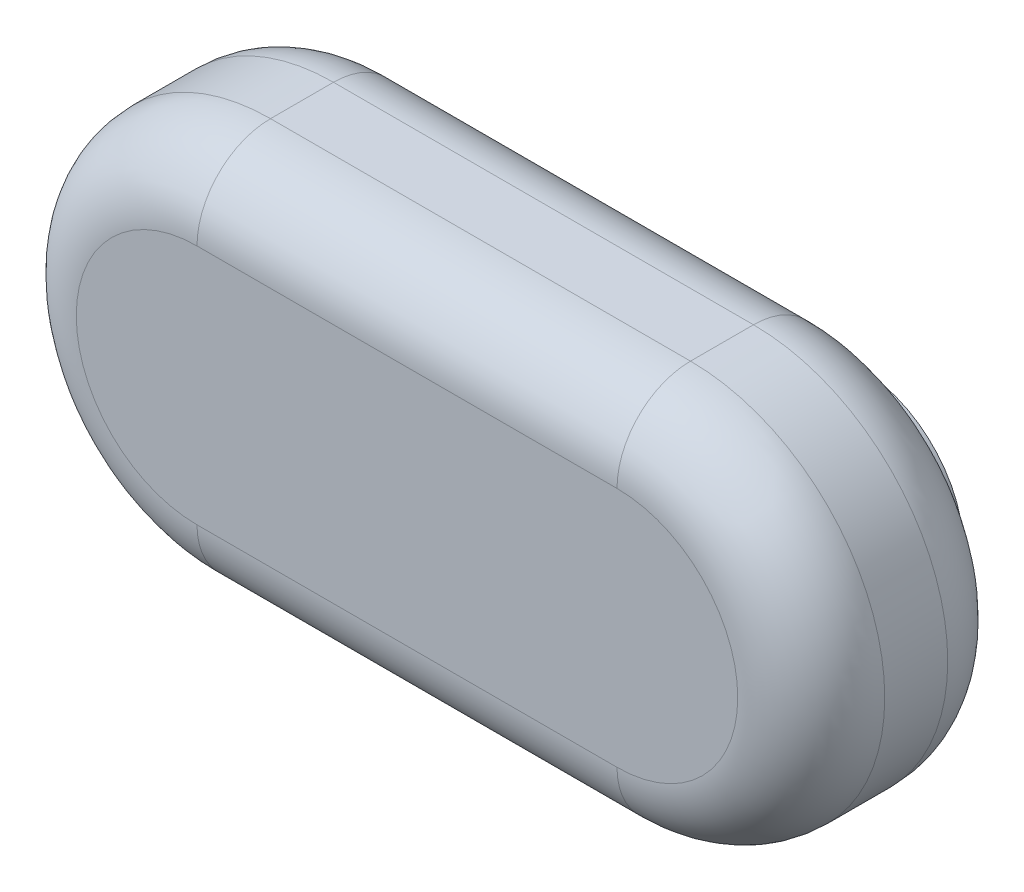
ISO-10303-21;
HEADER;
FILE_DESCRIPTION(('STEP AP214'),'2;1');
FILE_NAME('part.step','',(''),(''),'','','');
FILE_SCHEMA(('AUTOMOTIVE_DESIGN { 1 0 10303 214 1 1 1 1 }'));
ENDSEC;
DATA;
#1=APPLICATION_CONTEXT('core data for automotive mechanical design processes');
#2=APPLICATION_PROTOCOL_DEFINITION('international standard','automotive_design',2000,#1);
#3=PRODUCT_CONTEXT('',#1,'mechanical');
#4=PRODUCT('Part','Part','',(#3));
#5=PRODUCT_RELATED_PRODUCT_CATEGORY('part','',(#4));
#6=PRODUCT_DEFINITION_FORMATION('','',#4);
#7=PRODUCT_DEFINITION_CONTEXT('part definition',#1,'design');
#8=PRODUCT_DEFINITION('design','',#6,#7);
#9=PRODUCT_DEFINITION_SHAPE('','',#8);
#10=(LENGTH_UNIT() NAMED_UNIT(*) SI_UNIT(.MILLI.,.METRE.));
#11=(NAMED_UNIT(*) PLANE_ANGLE_UNIT() SI_UNIT($,.RADIAN.));
#12=(NAMED_UNIT(*) SI_UNIT($,.STERADIAN.) SOLID_ANGLE_UNIT());
#13=UNCERTAINTY_MEASURE_WITH_UNIT(LENGTH_MEASURE(1.E-05),#10,'distance_accuracy_value','');
#14=(GEOMETRIC_REPRESENTATION_CONTEXT(3) GLOBAL_UNCERTAINTY_ASSIGNED_CONTEXT((#13)) GLOBAL_UNIT_ASSIGNED_CONTEXT((#10,
#11,#12)) REPRESENTATION_CONTEXT('',''));
#15=CARTESIAN_POINT('',(0.,0.,0.));
#16=DIRECTION('',(0.,0.,1.));
#17=DIRECTION('',(1.,0.,0.));
#18=AXIS2_PLACEMENT_3D('',#15,#16,#17);
#19=CARTESIAN_POINT('',(-31.0422971957516,0.777981447534978,20.));
#20=DIRECTION('',(0.,0.,-1.));
#21=DIRECTION('',(-1.,0.,0.));
#22=AXIS2_PLACEMENT_3D('',#19,#20,#21);
#23=CYLINDRICAL_SURFACE('',#22,18.5);
#24=DIRECTION('',(0.,0.,-1.));
#25=VECTOR('',#24,1.);
#26=CARTESIAN_POINT('',(-31.0422971957516,-17.722018552465,20.));
#27=LINE('',#26,#25);
#28=CARTESIAN_POINT('',(-31.0422971957516,-17.722018552465,13.));
#29=VERTEX_POINT('',#28);
#30=CARTESIAN_POINT('',(-31.0422971957516,-17.722018552465,7.));
#31=VERTEX_POINT('',#30);
#32=EDGE_CURVE('E215',#29,#31,#27,.T.);
#33=ORIENTED_EDGE('',*,*,#32,.T.);
#34=CARTESIAN_POINT('',(-31.0422971957516,0.777981447534978,7.));
#35=DIRECTION('',(0.,0.,-1.));
#36=DIRECTION('',(-1.,0.,0.));
#37=AXIS2_PLACEMENT_3D('',#34,#35,#36);
#38=CIRCLE('',#37,18.5);
#39=CARTESIAN_POINT('',(-31.0422971957516,19.277981447535,7.));
#40=VERTEX_POINT('',#39);
#41=EDGE_CURVE('E244',#31,#40,#38,.F.);
#42=ORIENTED_EDGE('',*,*,#41,.T.);
#43=DIRECTION('',(0.,0.,-1.));
#44=VECTOR('',#43,1.);
#45=CARTESIAN_POINT('',(-31.0422971957516,19.277981447535,20.));
#46=LINE('',#45,#44);
#47=CARTESIAN_POINT('',(-31.0422971957516,19.277981447535,13.));
#48=VERTEX_POINT('',#47);
#49=EDGE_CURVE('E194',#48,#40,#46,.T.);
#50=ORIENTED_EDGE('',*,*,#49,.F.);
#51=CARTESIAN_POINT('',(-31.0422971957516,0.777981447534978,13.));
#52=DIRECTION('',(0.,0.,-1.));
#53=DIRECTION('',(-1.,0.,0.));
#54=AXIS2_PLACEMENT_3D('',#51,#52,#53);
#55=CIRCLE('',#54,18.5);
#56=EDGE_CURVE('E241',#48,#29,#55,.T.);
#57=ORIENTED_EDGE('',*,*,#56,.T.);
#58=EDGE_LOOP('',(#33,#42,#50,#57));
#59=FACE_BOUND('',#58,.T.);
#60=ADVANCED_FACE('F40',(#59),#23,.T.);
#61=CARTESIAN_POINT('',(-31.0422971957516,19.277981447535,20.));
#62=DIRECTION('',(0.,-1.,0.));
#63=DIRECTION('',(0.,0.,-1.));
#64=AXIS2_PLACEMENT_3D('',#61,#62,#63);
#65=PLANE('',#64);
#66=ORIENTED_EDGE('',*,*,#49,.T.);
#67=DIRECTION('',(-1.,0.,0.));
#68=VECTOR('',#67,1.);
#69=CARTESIAN_POINT('',(-71.0422971957516,19.277981447535,7.));
#70=LINE('',#69,#68);
#71=CARTESIAN_POINT('',(-71.0422971957516,19.277981447535,7.));
#72=VERTEX_POINT('',#71);
#73=EDGE_CURVE('E193',#40,#72,#70,.T.);
#74=ORIENTED_EDGE('',*,*,#73,.T.);
#75=DIRECTION('',(0.,0.,-1.));
#76=VECTOR('',#75,1.);
#77=CARTESIAN_POINT('',(-71.0422971957516,19.277981447535,20.));
#78=LINE('',#77,#76);
#79=CARTESIAN_POINT('',(-71.0422971957516,19.277981447535,13.));
#80=VERTEX_POINT('',#79);
#81=EDGE_CURVE('E200',#80,#72,#78,.T.);
#82=ORIENTED_EDGE('',*,*,#81,.F.);
#83=DIRECTION('',(-1.,0.,0.));
#84=VECTOR('',#83,1.);
#85=CARTESIAN_POINT('',(-31.0422971957516,19.277981447535,13.));
#86=LINE('',#85,#84);
#87=EDGE_CURVE('E184',#80,#48,#86,.F.);
#88=ORIENTED_EDGE('',*,*,#87,.T.);
#89=EDGE_LOOP('',(#66,#74,#82,#88));
#90=FACE_BOUND('',#89,.T.);
#91=ADVANCED_FACE('F208',(#90),#65,.F.);
#92=CARTESIAN_POINT('',(-71.0422971957516,0.777981447534977,20.));
#93=DIRECTION('',(0.,0.,-1.));
#94=DIRECTION('',(-1.,0.,0.));
#95=AXIS2_PLACEMENT_3D('',#92,#93,#94);
#96=CYLINDRICAL_SURFACE('',#95,18.5);
#97=ORIENTED_EDGE('',*,*,#81,.T.);
#98=CARTESIAN_POINT('',(-71.0422971957516,0.777981447534977,7.));
#99=DIRECTION('',(0.,0.,-1.));
#100=DIRECTION('',(-1.,0.,0.));
#101=AXIS2_PLACEMENT_3D('',#98,#99,#100);
#102=CIRCLE('',#101,18.5);
#103=CARTESIAN_POINT('',(-71.0422971957516,-17.722018552465,7.));
#104=VERTEX_POINT('',#103);
#105=EDGE_CURVE('E204',#72,#104,#102,.F.);
#106=ORIENTED_EDGE('',*,*,#105,.T.);
#107=DIRECTION('',(0.,0.,-1.));
#108=VECTOR('',#107,1.);
#109=CARTESIAN_POINT('',(-71.0422971957516,-17.722018552465,20.));
#110=LINE('',#109,#108);
#111=CARTESIAN_POINT('',(-71.0422971957516,-17.722018552465,13.));
#112=VERTEX_POINT('',#111);
#113=EDGE_CURVE('E202',#112,#104,#110,.T.);
#114=ORIENTED_EDGE('',*,*,#113,.F.);
#115=CARTESIAN_POINT('',(-71.0422971957516,0.777981447534977,13.));
#116=DIRECTION('',(0.,0.,-1.));
#117=DIRECTION('',(-1.,0.,0.));
#118=AXIS2_PLACEMENT_3D('',#115,#116,#117);
#119=CIRCLE('',#118,18.5);
#120=EDGE_CURVE('E176',#112,#80,#119,.T.);
#121=ORIENTED_EDGE('',*,*,#120,.T.);
#122=EDGE_LOOP('',(#97,#106,#114,#121));
#123=FACE_BOUND('',#122,.T.);
#124=ADVANCED_FACE('F199',(#123),#96,.T.);
#125=CARTESIAN_POINT('',(-71.0422971957516,-17.722018552465,20.));
#126=DIRECTION('',(0.,1.,0.));
#127=DIRECTION('',(-1.,0.,0.));
#128=AXIS2_PLACEMENT_3D('',#125,#126,#127);
#129=PLANE('',#128);
#130=ORIENTED_EDGE('',*,*,#113,.T.);
#131=DIRECTION('',(1.,0.,0.));
#132=VECTOR('',#131,1.);
#133=CARTESIAN_POINT('',(-31.0422971957516,-17.722018552465,7.));
#134=LINE('',#133,#132);
#135=EDGE_CURVE('E238',#104,#31,#134,.T.);
#136=ORIENTED_EDGE('',*,*,#135,.T.);
#137=ORIENTED_EDGE('',*,*,#32,.F.);
#138=DIRECTION('',(1.,0.,0.));
#139=VECTOR('',#138,1.);
#140=CARTESIAN_POINT('',(-71.0422971957516,-17.722018552465,13.));
#141=LINE('',#140,#139);
#142=EDGE_CURVE('E235',#29,#112,#141,.F.);
#143=ORIENTED_EDGE('',*,*,#142,.T.);
#144=EDGE_LOOP('',(#130,#136,#137,#143));
#145=FACE_BOUND('',#144,.T.);
#146=ADVANCED_FACE('F647',(#145),#129,.F.);
#147=CARTESIAN_POINT('',(-31.0422971957516,0.777981447534978,20.));
#148=DIRECTION('',(0.,0.,-1.));
#149=DIRECTION('',(-1.,0.,0.));
#150=AXIS2_PLACEMENT_3D('',#147,#148,#149);
#151=PLANE('',#150);
#152=DIRECTION('',(-1.,0.,0.));
#153=VECTOR('',#152,1.);
#154=CARTESIAN_POINT('',(-31.0422971957516,12.277981447535,20.));
#155=LINE('',#154,#153);
#156=CARTESIAN_POINT('',(-31.0422971957516,12.277981447535,20.));
#157=VERTEX_POINT('',#156);
#158=CARTESIAN_POINT('',(-71.0422971957516,12.277981447535,20.));
#159=VERTEX_POINT('',#158);
#160=EDGE_CURVE('E247',#157,#159,#155,.T.);
#161=ORIENTED_EDGE('',*,*,#160,.T.);
#162=CARTESIAN_POINT('',(-71.0422971957516,0.777981447534977,20.));
#163=DIRECTION('',(0.,0.,-1.));
#164=DIRECTION('',(-1.,0.,0.));
#165=AXIS2_PLACEMENT_3D('',#162,#163,#164);
#166=CIRCLE('',#165,11.5);
#167=CARTESIAN_POINT('',(-71.0422971957516,-10.722018552465,20.));
#168=VERTEX_POINT('',#167);
#169=EDGE_CURVE('E177',#159,#168,#166,.F.);
#170=ORIENTED_EDGE('',*,*,#169,.T.);
#171=DIRECTION('',(1.,0.,0.));
#172=VECTOR('',#171,1.);
#173=CARTESIAN_POINT('',(-31.0422971957516,-10.722018552465,20.));
#174=LINE('',#173,#172);
#175=CARTESIAN_POINT('',(-31.0422971957516,-10.722018552465,20.));
#176=VERTEX_POINT('',#175);
#177=EDGE_CURVE('E129',#168,#176,#174,.T.);
#178=ORIENTED_EDGE('',*,*,#177,.T.);
#179=CARTESIAN_POINT('',(-31.0422971957516,0.777981447534978,20.));
#180=DIRECTION('',(0.,0.,-1.));
#181=DIRECTION('',(-1.,0.,0.));
#182=AXIS2_PLACEMENT_3D('',#179,#180,#181);
#183=CIRCLE('',#182,11.5);
#184=EDGE_CURVE('E250',#176,#157,#183,.F.);
#185=ORIENTED_EDGE('',*,*,#184,.T.);
#186=EDGE_LOOP('',(#161,#170,#178,#185));
#187=FACE_BOUND('',#186,.T.);
#188=ADVANCED_FACE('F639',(#187),#151,.F.);
#189=CARTESIAN_POINT('',(-31.0422971957516,0.777981447534978,0.));
#190=DIRECTION('',(0.,0.,-1.));
#191=DIRECTION('',(-1.,0.,0.));
#192=AXIS2_PLACEMENT_3D('',#189,#190,#191);
#193=PLANE('',#192);
#194=CARTESIAN_POINT('',(-31.0422971957516,0.777981447534969,0.));
#195=DIRECTION('',(0.,0.,-1.));
#196=DIRECTION('',(-1.,0.,0.));
#197=AXIS2_PLACEMENT_3D('',#194,#195,#196);
#198=CIRCLE('',#197,10.);
#199=CARTESIAN_POINT('',(-41.0422971957516,0.777981447534969,0.));
#200=VERTEX_POINT('',#199);
#201=EDGE_CURVE('E714',#200,#200,#198,.T.);
#202=ORIENTED_EDGE('',*,*,#201,.F.);
#203=EDGE_LOOP('',(#202));
#204=FACE_BOUND('',#203,.T.);
#205=CARTESIAN_POINT('',(-71.0422971957516,0.777981447534977,0.));
#206=DIRECTION('',(0.,0.,-1.));
#207=DIRECTION('',(-1.,0.,0.));
#208=AXIS2_PLACEMENT_3D('',#205,#206,#207);
#209=CIRCLE('',#208,11.5);
#210=CARTESIAN_POINT('',(-71.0422971957516,-10.722018552465,0.));
#211=VERTEX_POINT('',#210);
#212=CARTESIAN_POINT('',(-71.0422971957516,12.277981447535,0.));
#213=VERTEX_POINT('',#212);
#214=EDGE_CURVE('E227',#211,#213,#209,.T.);
#215=ORIENTED_EDGE('',*,*,#214,.T.);
#216=DIRECTION('',(-1.,0.,0.));
#217=VECTOR('',#216,1.);
#218=CARTESIAN_POINT('',(-31.0422971957516,12.277981447535,0.));
#219=LINE('',#218,#217);
#220=CARTESIAN_POINT('',(-31.0422971957516,12.277981447535,0.));
#221=VERTEX_POINT('',#220);
#222=EDGE_CURVE('E205',#213,#221,#219,.F.);
#223=ORIENTED_EDGE('',*,*,#222,.T.);
#224=CARTESIAN_POINT('',(-31.0422971957516,0.777981447534978,0.));
#225=DIRECTION('',(0.,0.,-1.));
#226=DIRECTION('',(-1.,0.,0.));
#227=AXIS2_PLACEMENT_3D('',#224,#225,#226);
#228=CIRCLE('',#227,11.5);
#229=CARTESIAN_POINT('',(-31.0422971957516,-10.722018552465,0.));
#230=VERTEX_POINT('',#229);
#231=EDGE_CURVE('E221',#221,#230,#228,.T.);
#232=ORIENTED_EDGE('',*,*,#231,.T.);
#233=DIRECTION('',(1.,0.,0.));
#234=VECTOR('',#233,1.);
#235=CARTESIAN_POINT('',(-71.0422971957516,-10.722018552465,0.));
#236=LINE('',#235,#234);
#237=EDGE_CURVE('E224',#230,#211,#236,.F.);
#238=ORIENTED_EDGE('',*,*,#237,.T.);
#239=EDGE_LOOP('',(#215,#223,#232,#238));
#240=FACE_BOUND('',#239,.T.);
#241=ADVANCED_FACE('F630',(#204,#240),#193,.T.);
#242=CARTESIAN_POINT('',(-71.0422971957516,-10.722018552465,7.));
#243=DIRECTION('',(-1.,0.,0.));
#244=DIRECTION('',(0.,-1.,0.));
#245=AXIS2_PLACEMENT_3D('',#242,#243,#244);
#246=CYLINDRICAL_SURFACE('',#245,7.);
#247=CARTESIAN_POINT('',(-71.0422971957516,-10.722018552465,7.));
#248=DIRECTION('',(-1.,0.,0.));
#249=DIRECTION('',(0.,0.,1.));
#250=AXIS2_PLACEMENT_3D('',#247,#248,#249);
#251=CIRCLE('',#250,7.);
#252=EDGE_CURVE('E263',#211,#104,#251,.T.);
#253=ORIENTED_EDGE('',*,*,#252,.F.);
#254=ORIENTED_EDGE('',*,*,#237,.F.);
#255=CARTESIAN_POINT('',(-31.0422971957516,-10.722018552465,7.));
#256=DIRECTION('',(1.,0.,0.));
#257=DIRECTION('',(0.,1.,0.));
#258=AXIS2_PLACEMENT_3D('',#255,#256,#257);
#259=CIRCLE('',#258,7.);
#260=EDGE_CURVE('E267',#31,#230,#259,.T.);
#261=ORIENTED_EDGE('',*,*,#260,.F.);
#262=ORIENTED_EDGE('',*,*,#135,.F.);
#263=EDGE_LOOP('',(#253,#254,#261,#262));
#264=FACE_BOUND('',#263,.T.);
#265=ADVANCED_FACE('F621',(#264),#246,.T.);
#266=CARTESIAN_POINT('',(-31.0422971957516,0.777981447534978,7.));
#267=DIRECTION('',(0.,0.,-1.));
#268=DIRECTION('',(-1.,0.,0.));
#269=AXIS2_PLACEMENT_3D('',#266,#267,#268);
#270=TOROIDAL_SURFACE('',#269,11.5,7.);
#271=ORIENTED_EDGE('',*,*,#260,.T.);
#272=ORIENTED_EDGE('',*,*,#231,.F.);
#273=CARTESIAN_POINT('',(-31.0422971957516,12.277981447535,7.));
#274=DIRECTION('',(-1.,0.,0.));
#275=DIRECTION('',(0.,0.,1.));
#276=AXIS2_PLACEMENT_3D('',#273,#274,#275);
#277=CIRCLE('',#276,7.);
#278=EDGE_CURVE('E260',#40,#221,#277,.T.);
#279=ORIENTED_EDGE('',*,*,#278,.F.);
#280=ORIENTED_EDGE('',*,*,#41,.F.);
#281=EDGE_LOOP('',(#271,#272,#279,#280));
#282=FACE_BOUND('',#281,.T.);
#283=ADVANCED_FACE('F612',(#282),#270,.T.);
#284=CARTESIAN_POINT('',(-71.0422971957516,0.777981447534977,7.));
#285=DIRECTION('',(0.,0.,-1.));
#286=DIRECTION('',(-1.,0.,0.));
#287=AXIS2_PLACEMENT_3D('',#284,#285,#286);
#288=TOROIDAL_SURFACE('',#287,11.5,7.);
#289=ORIENTED_EDGE('',*,*,#252,.T.);
#290=ORIENTED_EDGE('',*,*,#105,.F.);
#291=CARTESIAN_POINT('',(-71.0422971957516,12.277981447535,7.));
#292=DIRECTION('',(1.,0.,0.));
#293=DIRECTION('',(0.,0.,-1.));
#294=AXIS2_PLACEMENT_3D('',#291,#292,#293);
#295=CIRCLE('',#294,7.);
#296=EDGE_CURVE('E257',#213,#72,#295,.T.);
#297=ORIENTED_EDGE('',*,*,#296,.F.);
#298=ORIENTED_EDGE('',*,*,#214,.F.);
#299=EDGE_LOOP('',(#289,#290,#297,#298));
#300=FACE_BOUND('',#299,.T.);
#301=ADVANCED_FACE('F603',(#300),#288,.T.);
#302=CARTESIAN_POINT('',(-31.0422971957516,12.277981447535,7.));
#303=DIRECTION('',(1.,0.,0.));
#304=DIRECTION('',(0.,0.,-1.));
#305=AXIS2_PLACEMENT_3D('',#302,#303,#304);
#306=CYLINDRICAL_SURFACE('',#305,7.);
#307=ORIENTED_EDGE('',*,*,#278,.T.);
#308=ORIENTED_EDGE('',*,*,#222,.F.);
#309=ORIENTED_EDGE('',*,*,#296,.T.);
#310=ORIENTED_EDGE('',*,*,#73,.F.);
#311=EDGE_LOOP('',(#307,#308,#309,#310));
#312=FACE_BOUND('',#311,.T.);
#313=ADVANCED_FACE('F595',(#312),#306,.T.);
#314=CARTESIAN_POINT('',(-31.0422971957516,0.777981447534978,13.));
#315=DIRECTION('',(0.,0.,-1.));
#316=DIRECTION('',(-1.,0.,0.));
#317=AXIS2_PLACEMENT_3D('',#314,#315,#316);
#318=TOROIDAL_SURFACE('',#317,11.5,7.);
#319=CARTESIAN_POINT('',(-31.0422971957516,-10.722018552465,13.));
#320=DIRECTION('',(-1.,0.,0.));
#321=DIRECTION('',(0.,-1.,0.));
#322=AXIS2_PLACEMENT_3D('',#319,#320,#321);
#323=CIRCLE('',#322,7.);
#324=EDGE_CURVE('E181',#29,#176,#323,.T.);
#325=ORIENTED_EDGE('',*,*,#324,.F.);
#326=ORIENTED_EDGE('',*,*,#56,.F.);
#327=CARTESIAN_POINT('',(-31.0422971957516,12.277981447535,13.));
#328=DIRECTION('',(-1.,0.,0.));
#329=DIRECTION('',(0.,0.,1.));
#330=AXIS2_PLACEMENT_3D('',#327,#328,#329);
#331=CIRCLE('',#330,7.);
#332=EDGE_CURVE('E187',#157,#48,#331,.T.);
#333=ORIENTED_EDGE('',*,*,#332,.F.);
#334=ORIENTED_EDGE('',*,*,#184,.F.);
#335=EDGE_LOOP('',(#325,#326,#333,#334));
#336=FACE_BOUND('',#335,.T.);
#337=ADVANCED_FACE('F421',(#336),#318,.T.);
#338=CARTESIAN_POINT('',(-31.0422971957516,12.277981447535,13.));
#339=DIRECTION('',(-1.,0.,0.));
#340=DIRECTION('',(0.,0.,1.));
#341=AXIS2_PLACEMENT_3D('',#338,#339,#340);
#342=CYLINDRICAL_SURFACE('',#341,7.);
#343=ORIENTED_EDGE('',*,*,#332,.T.);
#344=ORIENTED_EDGE('',*,*,#87,.F.);
#345=CARTESIAN_POINT('',(-71.0422971957516,12.277981447535,13.));
#346=DIRECTION('',(-1.,0.,0.));
#347=DIRECTION('',(0.,0.,1.));
#348=AXIS2_PLACEMENT_3D('',#345,#346,#347);
#349=CIRCLE('',#348,7.);
#350=EDGE_CURVE('E172',#159,#80,#349,.T.);
#351=ORIENTED_EDGE('',*,*,#350,.F.);
#352=ORIENTED_EDGE('',*,*,#160,.F.);
#353=EDGE_LOOP('',(#343,#344,#351,#352));
#354=FACE_BOUND('',#353,.T.);
#355=ADVANCED_FACE('F185',(#354),#342,.T.);
#356=CARTESIAN_POINT('',(-31.0422971957516,-10.722018552465,13.));
#357=DIRECTION('',(1.,0.,0.));
#358=DIRECTION('',(0.,1.,0.));
#359=AXIS2_PLACEMENT_3D('',#356,#357,#358);
#360=CYLINDRICAL_SURFACE('',#359,7.);
#361=ORIENTED_EDGE('',*,*,#324,.T.);
#362=ORIENTED_EDGE('',*,*,#177,.F.);
#363=CARTESIAN_POINT('',(-71.0422971957516,-10.722018552465,13.));
#364=DIRECTION('',(-1.,0.,0.));
#365=DIRECTION('',(0.,0.,1.));
#366=AXIS2_PLACEMENT_3D('',#363,#364,#365);
#367=CIRCLE('',#366,7.);
#368=EDGE_CURVE('E122',#112,#168,#367,.T.);
#369=ORIENTED_EDGE('',*,*,#368,.F.);
#370=ORIENTED_EDGE('',*,*,#142,.F.);
#371=EDGE_LOOP('',(#361,#362,#369,#370));
#372=FACE_BOUND('',#371,.T.);
#373=ADVANCED_FACE('F573',(#372),#360,.T.);
#374=CARTESIAN_POINT('',(-71.0422971957516,0.777981447534977,13.));
#375=DIRECTION('',(0.,0.,-1.));
#376=DIRECTION('',(-1.,0.,0.));
#377=AXIS2_PLACEMENT_3D('',#374,#375,#376);
#378=TOROIDAL_SURFACE('',#377,11.5,7.);
#379=ORIENTED_EDGE('',*,*,#350,.T.);
#380=ORIENTED_EDGE('',*,*,#120,.F.);
#381=ORIENTED_EDGE('',*,*,#368,.T.);
#382=ORIENTED_EDGE('',*,*,#169,.F.);
#383=EDGE_LOOP('',(#379,#380,#381,#382));
#384=FACE_BOUND('',#383,.T.);
#385=ADVANCED_FACE('F174',(#384),#378,.T.);
#386=CARTESIAN_POINT('',(-31.0422971957516,0.777981447534969,-3.));
#387=DIRECTION('',(0.,0.,1.));
#388=DIRECTION('',(1.,0.,0.));
#389=AXIS2_PLACEMENT_3D('',#386,#387,#388);
#390=CYLINDRICAL_SURFACE('',#389,10.);
#391=CARTESIAN_POINT('',(-31.0422971957516,0.777981447534969,-3.));
#392=DIRECTION('',(0.,0.,-1.));
#393=DIRECTION('',(-1.,0.,0.));
#394=AXIS2_PLACEMENT_3D('',#391,#392,#393);
#395=CIRCLE('',#394,10.);
#396=CARTESIAN_POINT('',(-41.0422971957516,0.777981447534969,-3.));
#397=VERTEX_POINT('',#396);
#398=EDGE_CURVE('E272',#397,#397,#395,.T.);
#399=ORIENTED_EDGE('',*,*,#398,.F.);
#400=EDGE_LOOP('',(#399));
#401=FACE_BOUND('',#400,.T.);
#402=ORIENTED_EDGE('',*,*,#201,.T.);
#403=EDGE_LOOP('',(#402));
#404=FACE_BOUND('',#403,.T.);
#405=ADVANCED_FACE('F555',(#401,#404),#390,.T.);
#406=CARTESIAN_POINT('',(-31.0422971957516,0.777981447534969,-3.));
#407=DIRECTION('',(0.,0.,-1.));
#408=DIRECTION('',(-1.,0.,0.));
#409=AXIS2_PLACEMENT_3D('',#406,#407,#408);
#410=PLANE('',#409);
#411=ORIENTED_EDGE('',*,*,#398,.T.);
#412=EDGE_LOOP('',(#411));
#413=FACE_BOUND('',#412,.T.);
#414=ADVANCED_FACE('F551',(#413),#410,.T.);
#415=CLOSED_SHELL('',(#60,#91,#124,#146,#188,#241,#265,#283,#301,#313,#337,#355,#373,#385,#405,#414));
#416=CARTESIAN_POINT('',(-31.0422971957516,0.777981447534978,20.));
#417=DIRECTION('',(0.,0.,-1.));
#418=DIRECTION('',(-1.,0.,0.));
#419=AXIS2_PLACEMENT_3D('',#416,#417,#418);
#420=CYLINDRICAL_SURFACE('',#419,17.);
#421=DIRECTION('',(0.,0.,-1.));
#422=VECTOR('',#421,1.);
#423=CARTESIAN_POINT('',(-31.0422971957516,-16.222018552465,20.));
#424=LINE('',#423,#422);
#425=CARTESIAN_POINT('',(-31.0422971957516,-16.222018552465,13.));
#426=VERTEX_POINT('',#425);
#427=CARTESIAN_POINT('',(-31.0422971957516,-16.222018552465,7.));
#428=VERTEX_POINT('',#427);
#429=EDGE_CURVE('E44',#426,#428,#424,.T.);
#430=ORIENTED_EDGE('',*,*,#429,.F.);
#431=CARTESIAN_POINT('',(-31.0422971957516,0.777981447534978,13.));
#432=DIRECTION('',(0.,0.,-1.));
#433=DIRECTION('',(-1.,0.,0.));
#434=AXIS2_PLACEMENT_3D('',#431,#432,#433);
#435=CIRCLE('',#434,17.);
#436=CARTESIAN_POINT('',(-31.0422971957516,17.777981447535,13.));
#437=VERTEX_POINT('',#436);
#438=EDGE_CURVE('E108',#437,#426,#435,.T.);
#439=ORIENTED_EDGE('',*,*,#438,.F.);
#440=DIRECTION('',(0.,0.,-1.));
#441=VECTOR('',#440,1.);
#442=CARTESIAN_POINT('',(-31.0422971957516,17.777981447535,20.));
#443=LINE('',#442,#441);
#444=CARTESIAN_POINT('',(-31.0422971957516,17.777981447535,7.));
#445=VERTEX_POINT('',#444);
#446=EDGE_CURVE('E361',#437,#445,#443,.T.);
#447=ORIENTED_EDGE('',*,*,#446,.T.);
#448=CARTESIAN_POINT('',(-31.0422971957516,0.777981447534978,7.));
#449=DIRECTION('',(0.,0.,-1.));
#450=DIRECTION('',(-1.,0.,0.));
#451=AXIS2_PLACEMENT_3D('',#448,#449,#450);
#452=CIRCLE('',#451,17.);
#453=EDGE_CURVE('E114',#428,#445,#452,.F.);
#454=ORIENTED_EDGE('',*,*,#453,.F.);
#455=EDGE_LOOP('',(#430,#439,#447,#454));
#456=FACE_BOUND('',#455,.T.);
#457=ADVANCED_FACE('F379',(#456),#420,.F.);
#458=CARTESIAN_POINT('',(-31.0422971957516,17.777981447535,20.));
#459=DIRECTION('',(0.,-1.,0.));
#460=DIRECTION('',(0.,0.,-1.));
#461=AXIS2_PLACEMENT_3D('',#458,#459,#460);
#462=PLANE('',#461);
#463=ORIENTED_EDGE('',*,*,#446,.F.);
#464=DIRECTION('',(1.,0.,0.));
#465=VECTOR('',#464,1.);
#466=CARTESIAN_POINT('',(-31.0422971957516,17.777981447535,13.));
#467=LINE('',#466,#465);
#468=CARTESIAN_POINT('',(-71.0422971957516,17.777981447535,13.));
#469=VERTEX_POINT('',#468);
#470=EDGE_CURVE('E354',#469,#437,#467,.T.);
#471=ORIENTED_EDGE('',*,*,#470,.F.);
#472=DIRECTION('',(0.,0.,-1.));
#473=VECTOR('',#472,1.);
#474=CARTESIAN_POINT('',(-71.0422971957516,17.777981447535,20.));
#475=LINE('',#474,#473);
#476=CARTESIAN_POINT('',(-71.0422971957516,17.777981447535,7.));
#477=VERTEX_POINT('',#476);
#478=EDGE_CURVE('E350',#469,#477,#475,.T.);
#479=ORIENTED_EDGE('',*,*,#478,.T.);
#480=DIRECTION('',(1.,0.,0.));
#481=VECTOR('',#480,1.);
#482=CARTESIAN_POINT('',(-31.0422971957516,17.777981447535,7.));
#483=LINE('',#482,#481);
#484=EDGE_CURVE('E357',#445,#477,#483,.F.);
#485=ORIENTED_EDGE('',*,*,#484,.F.);
#486=EDGE_LOOP('',(#463,#471,#479,#485));
#487=FACE_BOUND('',#486,.T.);
#488=ADVANCED_FACE('F389',(#487),#462,.T.);
#489=CARTESIAN_POINT('',(-71.0422971957516,0.777981447534977,20.));
#490=DIRECTION('',(0.,0.,-1.));
#491=DIRECTION('',(-1.,0.,0.));
#492=AXIS2_PLACEMENT_3D('',#489,#490,#491);
#493=CYLINDRICAL_SURFACE('',#492,17.);
#494=ORIENTED_EDGE('',*,*,#478,.F.);
#495=CARTESIAN_POINT('',(-71.0422971957516,0.777981447534977,13.));
#496=DIRECTION('',(0.,0.,-1.));
#497=DIRECTION('',(-1.,0.,0.));
#498=AXIS2_PLACEMENT_3D('',#495,#496,#497);
#499=CIRCLE('',#498,17.);
#500=CARTESIAN_POINT('',(-71.0422971957516,-16.222018552465,13.));
#501=VERTEX_POINT('',#500);
#502=EDGE_CURVE('E343',#501,#469,#499,.T.);
#503=ORIENTED_EDGE('',*,*,#502,.F.);
#504=DIRECTION('',(0.,0.,1.));
#505=VECTOR('',#504,1.);
#506=CARTESIAN_POINT('',(-71.0422971957516,-16.222018552465,20.));
#507=LINE('',#506,#505);
#508=CARTESIAN_POINT('',(-71.0422971957516,-16.222018552465,7.));
#509=VERTEX_POINT('',#508);
#510=EDGE_CURVE('E339',#501,#509,#507,.F.);
#511=ORIENTED_EDGE('',*,*,#510,.T.);
#512=CARTESIAN_POINT('',(-71.0422971957516,0.777981447534977,7.));
#513=DIRECTION('',(0.,0.,-1.));
#514=DIRECTION('',(-1.,0.,0.));
#515=AXIS2_PLACEMENT_3D('',#512,#513,#514);
#516=CIRCLE('',#515,17.);
#517=EDGE_CURVE('E347',#477,#509,#516,.F.);
#518=ORIENTED_EDGE('',*,*,#517,.F.);
#519=EDGE_LOOP('',(#494,#503,#511,#518));
#520=FACE_BOUND('',#519,.T.);
#521=ADVANCED_FACE('F394',(#520),#493,.F.);
#522=CARTESIAN_POINT('',(-71.0422971957516,-16.222018552465,20.));
#523=DIRECTION('',(0.,1.,0.));
#524=DIRECTION('',(-1.,0.,0.));
#525=AXIS2_PLACEMENT_3D('',#522,#523,#524);
#526=PLANE('',#525);
#527=ORIENTED_EDGE('',*,*,#510,.F.);
#528=DIRECTION('',(-1.,0.,0.));
#529=VECTOR('',#528,1.);
#530=CARTESIAN_POINT('',(-71.0422971957516,-16.222018552465,13.));
#531=LINE('',#530,#529);
#532=EDGE_CURVE('E333',#426,#501,#531,.T.);
#533=ORIENTED_EDGE('',*,*,#532,.F.);
#534=ORIENTED_EDGE('',*,*,#429,.T.);
#535=DIRECTION('',(-1.,0.,0.));
#536=VECTOR('',#535,1.);
#537=CARTESIAN_POINT('',(-71.0422971957516,-16.222018552465,7.));
#538=LINE('',#537,#536);
#539=EDGE_CURVE('E336',#509,#428,#538,.F.);
#540=ORIENTED_EDGE('',*,*,#539,.F.);
#541=EDGE_LOOP('',(#527,#533,#534,#540));
#542=FACE_BOUND('',#541,.T.);
#543=ADVANCED_FACE('F372',(#542),#526,.T.);
#544=CARTESIAN_POINT('',(-31.0422971957516,0.777981447534978,18.5));
#545=DIRECTION('',(0.,0.,-1.));
#546=DIRECTION('',(-1.,0.,0.));
#547=AXIS2_PLACEMENT_3D('',#544,#545,#546);
#548=PLANE('',#547);
#549=DIRECTION('',(-1.,0.,0.));
#550=VECTOR('',#549,1.);
#551=CARTESIAN_POINT('',(-31.0422971957516,12.277981447535,18.5));
#552=LINE('',#551,#550);
#553=CARTESIAN_POINT('',(-31.0422971957516,12.277981447535,18.5));
#554=VERTEX_POINT('',#553);
#555=CARTESIAN_POINT('',(-71.0422971957516,12.277981447535,18.5));
#556=VERTEX_POINT('',#555);
#557=EDGE_CURVE('E330',#554,#556,#552,.T.);
#558=ORIENTED_EDGE('',*,*,#557,.F.);
#559=CARTESIAN_POINT('',(-31.0422971957516,0.777981447534978,18.5));
#560=DIRECTION('',(0.,0.,-1.));
#561=DIRECTION('',(-1.,0.,0.));
#562=AXIS2_PLACEMENT_3D('',#559,#560,#561);
#563=CIRCLE('',#562,11.5);
#564=CARTESIAN_POINT('',(-31.0422971957516,-10.722018552465,18.5));
#565=VERTEX_POINT('',#564);
#566=EDGE_CURVE('E320',#565,#554,#563,.F.);
#567=ORIENTED_EDGE('',*,*,#566,.F.);
#568=DIRECTION('',(-1.,0.,0.));
#569=VECTOR('',#568,1.);
#570=CARTESIAN_POINT('',(-31.0422971957516,-10.722018552465,18.5));
#571=LINE('',#570,#569);
#572=CARTESIAN_POINT('',(-71.0422971957516,-10.722018552465,18.5));
#573=VERTEX_POINT('',#572);
#574=EDGE_CURVE('E323',#573,#565,#571,.F.);
#575=ORIENTED_EDGE('',*,*,#574,.F.);
#576=CARTESIAN_POINT('',(-71.0422971957516,0.777981447534977,18.5));
#577=DIRECTION('',(0.,0.,-1.));
#578=DIRECTION('',(-1.,0.,0.));
#579=AXIS2_PLACEMENT_3D('',#576,#577,#578);
#580=CIRCLE('',#579,11.5);
#581=EDGE_CURVE('E326',#556,#573,#580,.F.);
#582=ORIENTED_EDGE('',*,*,#581,.F.);
#583=EDGE_LOOP('',(#558,#567,#575,#582));
#584=FACE_BOUND('',#583,.T.);
#585=ADVANCED_FACE('F410',(#584),#548,.T.);
#586=CARTESIAN_POINT('',(-31.0422971957516,0.777981447534978,1.5));
#587=DIRECTION('',(0.,0.,-1.));
#588=DIRECTION('',(-1.,0.,0.));
#589=AXIS2_PLACEMENT_3D('',#586,#587,#588);
#590=PLANE('',#589);
#591=CARTESIAN_POINT('',(-31.0422971957516,0.777981447534969,1.5));
#592=DIRECTION('',(0.,0.,-1.));
#593=DIRECTION('',(-1.,0.,0.));
#594=AXIS2_PLACEMENT_3D('',#591,#592,#593);
#595=CIRCLE('',#594,8.5);
#596=CARTESIAN_POINT('',(-39.5422971957516,0.777981447534969,1.5));
#597=VERTEX_POINT('',#596);
#598=EDGE_CURVE('E52',#597,#597,#595,.T.);
#599=ORIENTED_EDGE('',*,*,#598,.T.);
#600=EDGE_LOOP('',(#599));
#601=FACE_BOUND('',#600,.T.);
#602=CARTESIAN_POINT('',(-71.0422971957516,0.777981447534977,1.5));
#603=DIRECTION('',(0.,0.,-1.));
#604=DIRECTION('',(-1.,0.,0.));
#605=AXIS2_PLACEMENT_3D('',#602,#603,#604);
#606=CIRCLE('',#605,11.5);
#607=CARTESIAN_POINT('',(-71.0422971957516,-10.722018552465,1.5));
#608=VERTEX_POINT('',#607);
#609=CARTESIAN_POINT('',(-71.0422971957516,12.277981447535,1.5));
#610=VERTEX_POINT('',#609);
#611=EDGE_CURVE('E317',#608,#610,#606,.T.);
#612=ORIENTED_EDGE('',*,*,#611,.F.);
#613=DIRECTION('',(-1.,0.,0.));
#614=VECTOR('',#613,1.);
#615=CARTESIAN_POINT('',(-31.0422971957516,-10.722018552465,1.5));
#616=LINE('',#615,#614);
#617=CARTESIAN_POINT('',(-31.0422971957516,-10.722018552465,1.5));
#618=VERTEX_POINT('',#617);
#619=EDGE_CURVE('E307',#618,#608,#616,.T.);
#620=ORIENTED_EDGE('',*,*,#619,.F.);
#621=CARTESIAN_POINT('',(-31.0422971957516,0.777981447534978,1.5));
#622=DIRECTION('',(0.,0.,-1.));
#623=DIRECTION('',(-1.,0.,0.));
#624=AXIS2_PLACEMENT_3D('',#621,#622,#623);
#625=CIRCLE('',#624,11.5);
#626=CARTESIAN_POINT('',(-31.0422971957516,12.277981447535,1.5));
#627=VERTEX_POINT('',#626);
#628=EDGE_CURVE('E310',#627,#618,#625,.T.);
#629=ORIENTED_EDGE('',*,*,#628,.F.);
#630=DIRECTION('',(-1.,0.,0.));
#631=VECTOR('',#630,1.);
#632=CARTESIAN_POINT('',(-31.0422971957516,12.277981447535,1.5));
#633=LINE('',#632,#631);
#634=EDGE_CURVE('E313',#610,#627,#633,.F.);
#635=ORIENTED_EDGE('',*,*,#634,.F.);
#636=EDGE_LOOP('',(#612,#620,#629,#635));
#637=FACE_BOUND('',#636,.T.);
#638=ADVANCED_FACE('F400',(#601,#637),#590,.F.);
#639=CARTESIAN_POINT('',(-71.0422971957516,-10.722018552465,7.));
#640=DIRECTION('',(-1.,0.,0.));
#641=DIRECTION('',(0.,-1.,0.));
#642=AXIS2_PLACEMENT_3D('',#639,#640,#641);
#643=CYLINDRICAL_SURFACE('',#642,5.5);
#644=CARTESIAN_POINT('',(-71.0422971957516,-10.722018552465,7.));
#645=DIRECTION('',(1.,0.,0.));
#646=DIRECTION('',(0.,1.,0.));
#647=AXIS2_PLACEMENT_3D('',#644,#645,#646);
#648=CIRCLE('',#647,5.5);
#649=EDGE_CURVE('E299',#608,#509,#648,.F.);
#650=ORIENTED_EDGE('',*,*,#649,.T.);
#651=ORIENTED_EDGE('',*,*,#539,.T.);
#652=CARTESIAN_POINT('',(-31.0422971957516,-10.722018552465,7.));
#653=DIRECTION('',(1.,0.,0.));
#654=DIRECTION('',(0.,1.,0.));
#655=AXIS2_PLACEMENT_3D('',#652,#653,#654);
#656=CIRCLE('',#655,5.5);
#657=EDGE_CURVE('E303',#428,#618,#656,.T.);
#658=ORIENTED_EDGE('',*,*,#657,.T.);
#659=ORIENTED_EDGE('',*,*,#619,.T.);
#660=EDGE_LOOP('',(#650,#651,#658,#659));
#661=FACE_BOUND('',#660,.T.);
#662=ADVANCED_FACE('F401',(#661),#643,.F.);
#663=CARTESIAN_POINT('',(-31.0422971957516,0.777981447534978,7.));
#664=DIRECTION('',(0.,0.,-1.));
#665=DIRECTION('',(-1.,0.,0.));
#666=AXIS2_PLACEMENT_3D('',#663,#664,#665);
#667=TOROIDAL_SURFACE('',#666,11.5,5.5);
#668=ORIENTED_EDGE('',*,*,#657,.F.);
#669=ORIENTED_EDGE('',*,*,#453,.T.);
#670=CARTESIAN_POINT('',(-31.0422971957516,12.277981447535,7.));
#671=DIRECTION('',(1.,0.,0.));
#672=DIRECTION('',(0.,0.,-1.));
#673=AXIS2_PLACEMENT_3D('',#670,#671,#672);
#674=CIRCLE('',#673,5.5);
#675=EDGE_CURVE('E296',#445,#627,#674,.F.);
#676=ORIENTED_EDGE('',*,*,#675,.T.);
#677=ORIENTED_EDGE('',*,*,#628,.T.);
#678=EDGE_LOOP('',(#668,#669,#676,#677));
#679=FACE_BOUND('',#678,.T.);
#680=ADVANCED_FACE('F375',(#679),#667,.F.);
#681=CARTESIAN_POINT('',(-71.0422971957516,0.777981447534977,7.));
#682=DIRECTION('',(0.,0.,-1.));
#683=DIRECTION('',(-1.,0.,0.));
#684=AXIS2_PLACEMENT_3D('',#681,#682,#683);
#685=TOROIDAL_SURFACE('',#684,11.5,5.5);
#686=ORIENTED_EDGE('',*,*,#649,.F.);
#687=ORIENTED_EDGE('',*,*,#611,.T.);
#688=CARTESIAN_POINT('',(-71.0422971957516,12.277981447535,7.));
#689=DIRECTION('',(1.,0.,0.));
#690=DIRECTION('',(0.,0.,-1.));
#691=AXIS2_PLACEMENT_3D('',#688,#689,#690);
#692=CIRCLE('',#691,5.5);
#693=EDGE_CURVE('E293',#610,#477,#692,.T.);
#694=ORIENTED_EDGE('',*,*,#693,.T.);
#695=ORIENTED_EDGE('',*,*,#517,.T.);
#696=EDGE_LOOP('',(#686,#687,#694,#695));
#697=FACE_BOUND('',#696,.T.);
#698=ADVANCED_FACE('F397',(#697),#685,.F.);
#699=CARTESIAN_POINT('',(-31.0422971957516,12.277981447535,7.));
#700=DIRECTION('',(1.,0.,0.));
#701=DIRECTION('',(0.,0.,-1.));
#702=AXIS2_PLACEMENT_3D('',#699,#700,#701);
#703=CYLINDRICAL_SURFACE('',#702,5.5);
#704=ORIENTED_EDGE('',*,*,#675,.F.);
#705=ORIENTED_EDGE('',*,*,#484,.T.);
#706=ORIENTED_EDGE('',*,*,#693,.F.);
#707=ORIENTED_EDGE('',*,*,#634,.T.);
#708=EDGE_LOOP('',(#704,#705,#706,#707));
#709=FACE_BOUND('',#708,.T.);
#710=ADVANCED_FACE('F386',(#709),#703,.F.);
#711=CARTESIAN_POINT('',(-31.0422971957516,0.777981447534978,13.));
#712=DIRECTION('',(0.,0.,-1.));
#713=DIRECTION('',(-1.,0.,0.));
#714=AXIS2_PLACEMENT_3D('',#711,#712,#713);
#715=TOROIDAL_SURFACE('',#714,11.5,5.5);
#716=CARTESIAN_POINT('',(-31.0422971957516,-10.722018552465,13.));
#717=DIRECTION('',(1.,0.,0.));
#718=DIRECTION('',(0.,1.,0.));
#719=AXIS2_PLACEMENT_3D('',#716,#717,#718);
#720=CIRCLE('',#719,5.5);
#721=EDGE_CURVE('E287',#426,#565,#720,.F.);
#722=ORIENTED_EDGE('',*,*,#721,.T.);
#723=ORIENTED_EDGE('',*,*,#566,.T.);
#724=CARTESIAN_POINT('',(-31.0422971957516,12.277981447535,13.));
#725=DIRECTION('',(-1.,0.,0.));
#726=DIRECTION('',(0.,0.,1.));
#727=AXIS2_PLACEMENT_3D('',#724,#725,#726);
#728=CIRCLE('',#727,5.5);
#729=EDGE_CURVE('E290',#554,#437,#728,.T.);
#730=ORIENTED_EDGE('',*,*,#729,.T.);
#731=ORIENTED_EDGE('',*,*,#438,.T.);
#732=EDGE_LOOP('',(#722,#723,#730,#731));
#733=FACE_BOUND('',#732,.T.);
#734=ADVANCED_FACE('F454',(#733),#715,.F.);
#735=CARTESIAN_POINT('',(-31.0422971957516,12.277981447535,13.));
#736=DIRECTION('',(-1.,0.,0.));
#737=DIRECTION('',(0.,0.,1.));
#738=AXIS2_PLACEMENT_3D('',#735,#736,#737);
#739=CYLINDRICAL_SURFACE('',#738,5.5);
#740=ORIENTED_EDGE('',*,*,#729,.F.);
#741=ORIENTED_EDGE('',*,*,#557,.T.);
#742=CARTESIAN_POINT('',(-71.0422971957516,12.277981447535,13.));
#743=DIRECTION('',(-1.,0.,0.));
#744=DIRECTION('',(0.,-1.,0.));
#745=AXIS2_PLACEMENT_3D('',#742,#743,#744);
#746=CIRCLE('',#745,5.5);
#747=EDGE_CURVE('E284',#556,#469,#746,.T.);
#748=ORIENTED_EDGE('',*,*,#747,.T.);
#749=ORIENTED_EDGE('',*,*,#470,.T.);
#750=EDGE_LOOP('',(#740,#741,#748,#749));
#751=FACE_BOUND('',#750,.T.);
#752=ADVANCED_FACE('F438',(#751),#739,.F.);
#753=CARTESIAN_POINT('',(-31.0422971957516,-10.722018552465,13.));
#754=DIRECTION('',(1.,0.,0.));
#755=DIRECTION('',(0.,1.,0.));
#756=AXIS2_PLACEMENT_3D('',#753,#754,#755);
#757=CYLINDRICAL_SURFACE('',#756,5.5);
#758=ORIENTED_EDGE('',*,*,#721,.F.);
#759=ORIENTED_EDGE('',*,*,#532,.T.);
#760=CARTESIAN_POINT('',(-71.0422971957516,-10.722018552465,13.));
#761=DIRECTION('',(1.,0.,0.));
#762=DIRECTION('',(0.,1.,0.));
#763=AXIS2_PLACEMENT_3D('',#760,#761,#762);
#764=CIRCLE('',#763,5.5);
#765=EDGE_CURVE('E61',#501,#573,#764,.F.);
#766=ORIENTED_EDGE('',*,*,#765,.T.);
#767=ORIENTED_EDGE('',*,*,#574,.T.);
#768=EDGE_LOOP('',(#758,#759,#766,#767));
#769=FACE_BOUND('',#768,.T.);
#770=ADVANCED_FACE('F443',(#769),#757,.F.);
#771=CARTESIAN_POINT('',(-71.0422971957516,0.777981447534977,13.));
#772=DIRECTION('',(0.,0.,-1.));
#773=DIRECTION('',(-1.,0.,0.));
#774=AXIS2_PLACEMENT_3D('',#771,#772,#773);
#775=TOROIDAL_SURFACE('',#774,11.5,5.5);
#776=ORIENTED_EDGE('',*,*,#747,.F.);
#777=ORIENTED_EDGE('',*,*,#581,.T.);
#778=ORIENTED_EDGE('',*,*,#765,.F.);
#779=ORIENTED_EDGE('',*,*,#502,.T.);
#780=EDGE_LOOP('',(#776,#777,#778,#779));
#781=FACE_BOUND('',#780,.T.);
#782=ADVANCED_FACE('F440',(#781),#775,.F.);
#783=CARTESIAN_POINT('',(-31.0422971957516,0.777981447534969,-3.));
#784=DIRECTION('',(0.,0.,1.));
#785=DIRECTION('',(1.,0.,0.));
#786=AXIS2_PLACEMENT_3D('',#783,#784,#785);
#787=CYLINDRICAL_SURFACE('',#786,8.5);
#788=CARTESIAN_POINT('',(-31.0422971957516,0.777981447534969,-1.5));
#789=DIRECTION('',(0.,0.,-1.));
#790=DIRECTION('',(-1.,0.,0.));
#791=AXIS2_PLACEMENT_3D('',#788,#789,#790);
#792=CIRCLE('',#791,8.5);
#793=CARTESIAN_POINT('',(-39.5422971957516,0.777981447534969,-1.5));
#794=VERTEX_POINT('',#793);
#795=EDGE_CURVE('E11',#794,#794,#792,.T.);
#796=ORIENTED_EDGE('',*,*,#795,.T.);
#797=EDGE_LOOP('',(#796));
#798=FACE_BOUND('',#797,.T.);
#799=ORIENTED_EDGE('',*,*,#598,.F.);
#800=EDGE_LOOP('',(#799));
#801=FACE_BOUND('',#800,.T.);
#802=ADVANCED_FACE('F442',(#798,#801),#787,.F.);
#803=CARTESIAN_POINT('',(-31.0422971957516,0.777981447534969,-1.5));
#804=DIRECTION('',(0.,0.,-1.));
#805=DIRECTION('',(-1.,0.,0.));
#806=AXIS2_PLACEMENT_3D('',#803,#804,#805);
#807=PLANE('',#806);
#808=ORIENTED_EDGE('',*,*,#795,.F.);
#809=EDGE_LOOP('',(#808));
#810=FACE_BOUND('',#809,.T.);
#811=ADVANCED_FACE('F42',(#810),#807,.F.);
#812=CLOSED_SHELL('',(#457,#488,#521,#543,#585,#638,#662,#680,#698,#710,#734,#752,#770,#782,
#802,#811));
#813=ORIENTED_CLOSED_SHELL('',*,#812,.T.);
#814=BREP_WITH_VOIDS('B2',#415,(#813));
#815=ADVANCED_BREP_SHAPE_REPRESENTATION('',(#18,#814),#14);
#816=SHAPE_DEFINITION_REPRESENTATION(#9,#815);
ENDSEC;
END-ISO-10303-21;
